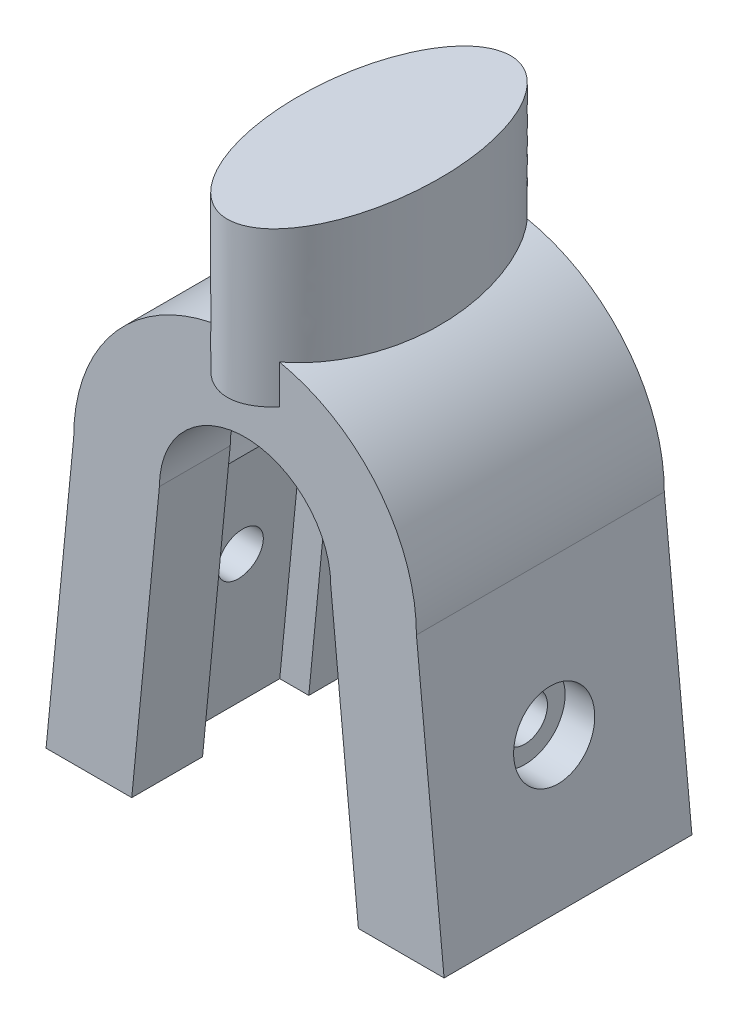
ISO-10303-21;
HEADER;
FILE_DESCRIPTION(('STEP AP214'),'2;1');
FILE_NAME('part.step','',(''),(''),'','','');
FILE_SCHEMA(('AUTOMOTIVE_DESIGN { 1 0 10303 214 1 1 1 1 }'));
ENDSEC;
DATA;
#1=APPLICATION_CONTEXT('core data for automotive mechanical design processes');
#2=APPLICATION_PROTOCOL_DEFINITION('international standard','automotive_design',2000,#1);
#3=PRODUCT_CONTEXT('',#1,'mechanical');
#4=PRODUCT('Part','Part','',(#3));
#5=PRODUCT_RELATED_PRODUCT_CATEGORY('part','',(#4));
#6=PRODUCT_DEFINITION_FORMATION('','',#4);
#7=PRODUCT_DEFINITION_CONTEXT('part definition',#1,'design');
#8=PRODUCT_DEFINITION('design','',#6,#7);
#9=PRODUCT_DEFINITION_SHAPE('','',#8);
#10=(LENGTH_UNIT() NAMED_UNIT(*) SI_UNIT(.MILLI.,.METRE.));
#11=(NAMED_UNIT(*) PLANE_ANGLE_UNIT() SI_UNIT($,.RADIAN.));
#12=(NAMED_UNIT(*) SI_UNIT($,.STERADIAN.) SOLID_ANGLE_UNIT());
#13=UNCERTAINTY_MEASURE_WITH_UNIT(LENGTH_MEASURE(1.E-05),#10,'distance_accuracy_value','');
#14=(GEOMETRIC_REPRESENTATION_CONTEXT(3) GLOBAL_UNCERTAINTY_ASSIGNED_CONTEXT((#13)) GLOBAL_UNIT_ASSIGNED_CONTEXT((#10,
#11,#12)) REPRESENTATION_CONTEXT('',''));
#15=CARTESIAN_POINT('',(0.,0.,0.));
#16=DIRECTION('',(0.,0.,1.));
#17=DIRECTION('',(1.,0.,0.));
#18=AXIS2_PLACEMENT_3D('',#15,#16,#17);
#19=CARTESIAN_POINT('',(0.,0.,3.75));
#20=DIRECTION('',(0.,0.,-1.));
#21=DIRECTION('',(-1.,0.,0.));
#22=AXIS2_PLACEMENT_3D('',#19,#20,#21);
#23=CYLINDRICAL_SURFACE('',#22,12.1);
#24=CARTESIAN_POINT('',(2.42061459137964,11.8554048855364,8.75));
#25=CARTESIAN_POINT('',(2.50643618520199,11.8378706884602,8.65498489595022));
#26=CARTESIAN_POINT('',(2.58895416534871,11.8200626652732,8.55712305635404));
#27=CARTESIAN_POINT('',(2.74766163276391,11.7841855013176,8.35683941342592));
#28=CARTESIAN_POINT('',(2.82386656318519,11.7661171328033,8.25442973922325));
#29=CARTESIAN_POINT('',(2.9706080808039,11.7299264411373,8.0457621152009));
#30=CARTESIAN_POINT('',(3.04114825307558,11.7118041597591,7.93950666204494));
#31=CARTESIAN_POINT('',(3.1764969552689,11.6758183855375,7.7245781818871));
#32=CARTESIAN_POINT('',(3.24134668623073,11.6579539812973,7.61593117294931));
#33=CARTESIAN_POINT('',(3.36635063237683,11.6224741966009,7.39584235952127));
#34=CARTESIAN_POINT('',(3.4265017963319,11.6048589839491,7.28439880000834));
#35=CARTESIAN_POINT('',(3.54240598731303,11.5700050782022,7.05914668931327));
#36=CARTESIAN_POINT('',(3.59815735363494,11.5527665290373,6.94533726541942));
#37=CARTESIAN_POINT('',(3.75352692143558,11.5035842013758,6.61308447633006));
#38=CARTESIAN_POINT('',(3.8478144263619,11.472268483465,6.39203973711786));
#39=CARTESIAN_POINT('',(4.02319460997471,11.4119447810334,5.94444545798705));
#40=CARTESIAN_POINT('',(4.10428285461421,11.3829375736797,5.71789409747453));
#41=CARTESIAN_POINT('',(4.25446869365303,11.3276606692834,5.2604978710072));
#42=CARTESIAN_POINT('',(4.32356432479889,11.3013914207398,5.02965230890473));
#43=CARTESIAN_POINT('',(4.45114220240242,11.2517574842043,4.56295447299616));
#44=CARTESIAN_POINT('',(4.50954466593577,11.2284150099442,4.32707814919772));
#45=CARTESIAN_POINT('',(4.61584247495223,11.1851369069308,3.85272857983842));
#46=CARTESIAN_POINT('',(4.66374026592929,11.1652004854857,3.61425595229653));
#47=CARTESIAN_POINT('',(4.74960484193932,11.1289452456146,3.13524295647929));
#48=CARTESIAN_POINT('',(4.78757072140589,11.1126267570831,2.8947024017194));
#49=CARTESIAN_POINT('',(4.85727000828971,11.0823515240966,2.38817607574638));
#50=CARTESIAN_POINT('',(4.88801329341267,11.0687889381914,2.12203038670875));
#51=CARTESIAN_POINT('',(4.93838311971439,11.0464079529169,1.58845935558743));
#52=CARTESIAN_POINT('',(4.95800810248322,11.0375902186241,1.32103383941027));
#53=CARTESIAN_POINT('',(4.98637517162472,11.0248040598191,0.785376662403085));
#54=CARTESIAN_POINT('',(4.99511256832398,11.0208377249919,0.517144704039663));
#55=CARTESIAN_POINT('',(5.00179155164676,11.0178080595537,-0.0195182721785169));
#56=CARTESIAN_POINT('',(4.99973162162342,11.01874541774,-0.287949312702308));
#57=CARTESIAN_POINT('',(4.98478200892606,11.025516592183,-0.824682837932025));
#58=CARTESIAN_POINT('',(4.97188290388153,11.0313546685733,-1.09298500750642));
#59=CARTESIAN_POINT('',(4.93509327257373,11.0478623247859,-1.62864908934115));
#60=CARTESIAN_POINT('',(4.91120436546272,11.0585311928733,-1.89601113426711));
#61=CARTESIAN_POINT('',(4.85216116419241,11.0845646506067,-2.42912171366028));
#62=CARTESIAN_POINT('',(4.81701274635362,11.0999267906486,-2.69487101626076));
#63=CARTESIAN_POINT('',(4.73500716818458,11.1351561989267,-3.22422200603389));
#64=CARTESIAN_POINT('',(4.6881519633556,11.155022714701,-3.48782404429947));
#65=CARTESIAN_POINT('',(4.58767435384198,11.1966905007156,-3.98459666529946));
#66=CARTESIAN_POINT('',(4.53528230427108,11.2180684090467,-4.21805149752168));
#67=CARTESIAN_POINT('',(4.41999711333215,11.263990450246,-4.68205424402655));
#68=CARTESIAN_POINT('',(4.35710392404884,11.2885345975613,-4.9126021450401));
#69=CARTESIAN_POINT('',(4.21997202643504,11.3405124028953,-5.37015393559722));
#70=CARTESIAN_POINT('',(4.1457258181024,11.3679479672835,-5.59715537221579));
#71=CARTESIAN_POINT('',(3.98558673253558,11.4250719431486,-6.04445235444707));
#72=CARTESIAN_POINT('',(3.89980293873047,11.4547382268481,-6.26478950831554));
#73=CARTESIAN_POINT('',(3.71483052378889,11.51605534294,-6.69936989032182));
#74=CARTESIAN_POINT('',(3.61564902062185,11.5477051167847,-6.91361628170725));
#75=CARTESIAN_POINT('',(3.40226016218914,11.6123672197559,-7.33404327167851));
#76=CARTESIAN_POINT('',(3.28807273404452,11.6453777027125,-7.54023410464205));
#77=CARTESIAN_POINT('',(3.11080600130697,11.6934188915174,-7.83015152201138));
#78=CARTESIAN_POINT('',(3.05464653952211,11.708232610106,-7.91817579730383));
#79=CARTESIAN_POINT('',(2.9387097376606,11.737868996183,-8.09178117121448));
#80=CARTESIAN_POINT('',(2.87893343207902,11.7526916599233,-8.17736295822652));
#81=CARTESIAN_POINT('',(2.75523015878577,11.7823078256011,-8.34609924545083));
#82=CARTESIAN_POINT('',(2.69128561079954,11.7971008910601,-8.42924098989957));
#83=CARTESIAN_POINT('',(2.55917578743191,11.8264605479602,-8.59223427803566));
#84=CARTESIAN_POINT('',(2.49100760320486,11.8410269744782,-8.67208348965852));
#85=CARTESIAN_POINT('',(2.42061459137965,11.8554048855364,-8.74999999999999));
#86=B_SPLINE_CURVE_WITH_KNOTS('',3,(#24,#25,#26,#27,#28,#29,#30,#31,#32,#33,#34,#35,#36,#37,#38,
#39,#40,#41,#42,#43,#44,#45,#46,#47,#48,#49,#50,#51,#52,#53,#54,#55,#56,#57,#58,#59,#60,#61,#62,
#63,#64,#65,#66,#67,#68,#69,#70,#71,#72,#73,#74,#75,#76,#77,#78,#79,#80,#81,#82,#83,#84,#85),
.UNSPECIFIED.,.F.,.F.,(4,2,2,2,2,2,2,2,2,2,2,2,2,2,2,2,2,2,2,2,2,2,2,2,2,2,2,2,2,2,4),(0.,
0.387526838223619,0.774075839006698,1.16037824303432,1.54360176442405,1.92707211556356,
2.31068652216508,3.03717761169919,3.7639122510301,4.4907657486345,5.22283910505665,
5.95474185303582,6.68671131080242,7.49119918106149,8.29579978542879,9.1007468404396,
9.90580696539608,10.7115676447232,11.5172096475188,12.3224318701992,13.1275196784085,
13.8479172243028,14.5683180573635,15.2891968724027,16.0036850505045,16.7177951155945,
17.4309662839181,17.7472712881838,18.063486246207,18.381134046899,18.6990030992238),.UNSPECIFIED.);
#87=CARTESIAN_POINT('',(2.42061459137964,11.8554048855364,8.75));
#88=VERTEX_POINT('',#87);
#89=CARTESIAN_POINT('',(2.42061459137964,11.8554048855364,-8.75));
#90=VERTEX_POINT('',#89);
#91=EDGE_CURVE('E254',#88,#90,#86,.T.);
#92=ORIENTED_EDGE('',*,*,#91,.F.);
#93=CARTESIAN_POINT('',(0.,0.,8.75));
#94=DIRECTION('',(0.,0.,1.));
#95=DIRECTION('',(1.,0.,0.));
#96=AXIS2_PLACEMENT_3D('',#93,#94,#95);
#97=CIRCLE('',#96,12.1);
#98=CARTESIAN_POINT('',(12.1,0.,8.75));
#99=VERTEX_POINT('',#98);
#100=EDGE_CURVE('E356',#99,#88,#97,.T.);
#101=ORIENTED_EDGE('',*,*,#100,.F.);
#102=DIRECTION('',(0.,0.,-1.));
#103=VECTOR('',#102,1.);
#104=CARTESIAN_POINT('',(12.1,0.,3.75));
#105=LINE('',#104,#103);
#106=CARTESIAN_POINT('',(12.1,0.,-8.75));
#107=VERTEX_POINT('',#106);
#108=EDGE_CURVE('E184',#99,#107,#105,.T.);
#109=ORIENTED_EDGE('',*,*,#108,.T.);
#110=CARTESIAN_POINT('',(0.,0.,-8.75));
#111=DIRECTION('',(0.,0.,1.));
#112=DIRECTION('',(1.,0.,0.));
#113=AXIS2_PLACEMENT_3D('',#110,#111,#112);
#114=CIRCLE('',#113,12.1);
#115=EDGE_CURVE('E194',#107,#90,#114,.T.);
#116=ORIENTED_EDGE('',*,*,#115,.T.);
#117=EDGE_LOOP('',(#92,#101,#109,#116));
#118=FACE_BOUND('',#117,.T.);
#119=ADVANCED_FACE('F35',(#118),#23,.T.);
#120=CARTESIAN_POINT('',(-2.42061459137964,11.8554048855364,-8.75));
#121=CARTESIAN_POINT('',(-2.50640960584318,11.8378761292543,-8.65501436479337));
#122=CARTESIAN_POINT('',(-2.58890304249934,11.820073705092,-8.55718371453212));
#123=CARTESIAN_POINT('',(-2.7475726145864,11.7842061453629,-8.3569556193633));
#124=CARTESIAN_POINT('',(-2.8237636083726,11.7661417529776,-8.25456984469903));
#125=CARTESIAN_POINT('',(-2.97048289992936,11.7299580814006,-8.04594639518649));
#126=CARTESIAN_POINT('',(-3.04101451798658,11.71183884096,-7.93971103274757));
#127=CARTESIAN_POINT('',(-3.17637817586053,11.6758508337226,-7.72477472042136));
#128=CARTESIAN_POINT('',(-3.24124908708527,11.6579812080104,-7.61609831867762));
#129=CARTESIAN_POINT('',(-3.36629036440665,11.6224917768349,-7.39595315991942));
#130=CARTESIAN_POINT('',(-3.42645786340485,11.6048721290267,-7.28448275357319));
#131=CARTESIAN_POINT('',(-3.54238698902984,11.5700108570483,-7.05918503679259));
#132=CARTESIAN_POINT('',(-3.59814730106425,11.5527693467701,-6.94535703580826));
#133=CARTESIAN_POINT('',(-3.76568792171126,11.4997354021438,-6.58708223154248));
#134=CARTESIAN_POINT('',(-3.87027102378068,11.4647918964883,-6.33911714274294));
#135=CARTESIAN_POINT('',(-4.06307087415462,11.3978870001557,-5.83661056952575));
#136=CARTESIAN_POINT('',(-4.15128774488575,11.3659255871721,-5.5820691343183));
#137=CARTESIAN_POINT('',(-4.31335987439657,11.3054162518381,-5.06682584522103));
#138=CARTESIAN_POINT('',(-4.38714996397016,11.2768840335796,-4.80610174351351));
#139=CARTESIAN_POINT('',(-4.52112309238692,11.223841980531,-4.28073954530075));
#140=CARTESIAN_POINT('',(-4.58130316486027,11.1993330229488,-4.01610060890328));
#141=CARTESIAN_POINT('',(-4.68394470738446,11.1567670821426,-3.50862150217758));
#142=CARTESIAN_POINT('',(-4.72753289042076,11.1383222231204,-3.26604030936564));
#143=CARTESIAN_POINT('',(-4.80474276866003,11.1052323659035,-2.77903066033766));
#144=CARTESIAN_POINT('',(-4.83836329799407,11.0905878122374,-2.53460199145729));
#145=CARTESIAN_POINT('',(-4.92486863646501,11.0525935992835,-1.79910490291822));
#146=CARTESIAN_POINT('',(-4.96337166519415,11.0351943418931,-1.30595431875602));
#147=CARTESIAN_POINT('',(-5.00364363878702,11.0169848168022,-0.317136583432664));
#148=CARTESIAN_POINT('',(-5.00535096286468,11.0162023768752,0.178533398987819));
#149=CARTESIAN_POINT('',(-4.97194898926279,11.0313255026948,1.16829347472161));
#150=CARTESIAN_POINT('',(-4.93685406018197,11.0472245555352,1.66238410913653));
#151=CARTESIAN_POINT('',(-4.85560410183184,11.083045071611,2.39902045427445));
#152=CARTESIAN_POINT('',(-4.82380775507311,11.0969568693415,2.64352702940559));
#153=CARTESIAN_POINT('',(-4.75033860946047,11.1286077215934,3.13080284990089));
#154=CARTESIAN_POINT('',(-4.70866666789344,11.1463464438927,3.37357224418388));
#155=CARTESIAN_POINT('',(-4.61497378855096,11.1854633492711,3.85684368832507));
#156=CARTESIAN_POINT('',(-4.56295163741828,11.2068419590125,4.09734546888492));
#157=CARTESIAN_POINT('',(-4.44832240076297,11.2528316875686,4.57374235281962));
#158=CARTESIAN_POINT('',(-4.38579092864675,11.277419452843,4.80965780341752));
#159=CARTESIAN_POINT('',(-4.24908460111076,11.3296352997176,5.27774514981429));
#160=CARTESIAN_POINT('',(-4.17491053843807,11.3572631742778,5.50991729930948));
#161=CARTESIAN_POINT('',(-4.0138437848437,11.4151829532618,5.96950823198901));
#162=CARTESIAN_POINT('',(-3.92695149716799,11.4454747732101,6.19692716561838));
#163=CARTESIAN_POINT('',(-3.77448651987469,11.4963924268716,6.56095846917733));
#164=CARTESIAN_POINT('',(-3.7132284053103,11.5163563505772,6.69947816452095));
#165=CARTESIAN_POINT('',(-3.58483481359396,11.5569674942369,6.97360096939293));
#166=CARTESIAN_POINT('',(-3.51770199642858,11.5776144023377,7.1092053646376));
#167=CARTESIAN_POINT('',(-3.37710619578076,11.6194030782761,7.37687346977757));
#168=CARTESIAN_POINT('',(-3.30364878386986,11.6405443988454,7.50894016435672));
#169=CARTESIAN_POINT('',(-3.14904239660449,11.6833227155435,7.77016681311085));
#170=CARTESIAN_POINT('',(-3.06782662524979,11.7049625178317,7.89928692763695));
#171=CARTESIAN_POINT('',(-2.89753392158762,11.7482776327216,8.15243865657274));
#172=CARTESIAN_POINT('',(-2.80845051676486,11.7699529598889,8.27646595603618));
#173=CARTESIAN_POINT('',(-2.66824751594478,11.8022354401593,8.45779266896773));
#174=CARTESIAN_POINT('',(-2.62032541156147,11.8129768148837,8.51755163384715));
#175=CARTESIAN_POINT('',(-2.52220404271945,11.8343145904848,8.63521966522098));
#176=CARTESIAN_POINT('',(-2.47200423120985,11.8449109557297,8.69312828155328));
#177=CARTESIAN_POINT('',(-2.42061459137964,11.8554048855364,8.75));
#178=B_SPLINE_CURVE_WITH_KNOTS('',3,(#120,#121,#122,#123,#124,#125,#126,#127,#128,#129,#130,
#131,#132,#133,#134,#135,#136,#137,#138,#139,#140,#141,#142,#143,#144,#145,#146,#147,#148,#149,
#150,#151,#152,#153,#154,#155,#156,#157,#158,#159,#160,#161,#162,#163,#164,#165,#166,#167,#168,
#169,#170,#171,#172,#173,#174,#175,#176,#177),.UNSPECIFIED.,.F.,.F.,(4,2,2,2,2,2,2,2,2,2,2,2,2,
2,2,2,2,2,2,2,2,2,2,2,2,2,2,2,4),(0.,0.387406828586594,0.773872623376962,1.16010999986502,
1.5434429403202,1.92700775904449,2.31068656050792,3.12405145798735,3.9374102708938,
4.75436238075783,5.57149237809692,6.31270680859464,7.05400790123809,8.53700442342335,
10.0224842877363,11.507384396238,12.2480697969671,12.9886909233461,13.7293989241068,
14.4649894483365,15.2005299077227,15.936047051001,16.39423846221,16.8522234734508,
17.3098090777341,17.7717676131552,18.2341097954595,18.4661106318583,18.6981674873665),.UNSPECIFIED.);
#179=CARTESIAN_POINT('',(-2.42061459137964,11.8554048855364,-8.75));
#180=VERTEX_POINT('',#179);
#181=CARTESIAN_POINT('',(-2.42061459137964,11.8554048855364,8.75));
#182=VERTEX_POINT('',#181);
#183=EDGE_CURVE('E50',#180,#182,#178,.T.);
#184=ORIENTED_EDGE('',*,*,#183,.F.);
#185=CARTESIAN_POINT('',(-12.1,0.,-8.75));
#186=VERTEX_POINT('',#185);
#187=EDGE_CURVE('E216',#180,#186,#114,.T.);
#188=ORIENTED_EDGE('',*,*,#187,.T.);
#189=DIRECTION('',(0.,0.,-1.));
#190=VECTOR('',#189,1.);
#191=CARTESIAN_POINT('',(-12.1,0.,3.75));
#192=LINE('',#191,#190);
#193=CARTESIAN_POINT('',(-12.1,0.,8.75));
#194=VERTEX_POINT('',#193);
#195=EDGE_CURVE('E441',#194,#186,#192,.T.);
#196=ORIENTED_EDGE('',*,*,#195,.F.);
#197=EDGE_CURVE('E362',#182,#194,#97,.T.);
#198=ORIENTED_EDGE('',*,*,#197,.F.);
#199=EDGE_LOOP('',(#184,#188,#196,#198));
#200=FACE_BOUND('',#199,.T.);
#201=ADVANCED_FACE('F298',(#200),#23,.T.);
#202=CARTESIAN_POINT('',(0.,0.,8.75));
#203=DIRECTION('',(0.,0.,1.));
#204=DIRECTION('',(1.,0.,0.));
#205=AXIS2_PLACEMENT_3D('',#202,#203,#204);
#206=PLANE('',#205);
#207=ORIENTED_EDGE('',*,*,#100,.T.);
#208=DIRECTION('',(0.,-1.,0.));
#209=VECTOR('',#208,1.);
#210=CARTESIAN_POINT('',(2.42061459137964,14.55,8.75));
#211=LINE('',#210,#209);
#212=CARTESIAN_POINT('',(2.42061459137964,9.1,8.75));
#213=VERTEX_POINT('',#212);
#214=EDGE_CURVE('E360',#88,#213,#211,.T.);
#215=ORIENTED_EDGE('',*,*,#214,.T.);
#216=DIRECTION('',(-1.,0.,0.));
#217=VECTOR('',#216,1.);
#218=CARTESIAN_POINT('',(0.,9.1,8.75));
#219=LINE('',#218,#217);
#220=CARTESIAN_POINT('',(-2.42061459137964,9.1,8.75));
#221=VERTEX_POINT('',#220);
#222=EDGE_CURVE('E450',#213,#221,#219,.T.);
#223=ORIENTED_EDGE('',*,*,#222,.T.);
#224=DIRECTION('',(0.,-1.,0.));
#225=VECTOR('',#224,1.);
#226=CARTESIAN_POINT('',(-2.42061459137964,14.55,8.75));
#227=LINE('',#226,#225);
#228=EDGE_CURVE('E443',#221,#182,#227,.F.);
#229=ORIENTED_EDGE('',*,*,#228,.T.);
#230=ORIENTED_EDGE('',*,*,#197,.T.);
#231=DIRECTION('',(-0.0971236804488314,-0.995272319868323,0.));
#232=VECTOR('',#231,1.);
#233=CARTESIAN_POINT('',(-11.9858605874225,1.16964058012894,8.75));
#234=LINE('',#233,#232);
#235=CARTESIAN_POINT('',(-14.0517006252456,-20.,8.75));
#236=VERTEX_POINT('',#235);
#237=EDGE_CURVE('E361',#194,#236,#234,.T.);
#238=ORIENTED_EDGE('',*,*,#237,.T.);
#239=DIRECTION('',(1.,0.,0.));
#240=VECTOR('',#239,1.);
#241=CARTESIAN_POINT('',(0.,-20.,8.75));
#242=LINE('',#241,#240);
#243=CARTESIAN_POINT('',(-8.00170062524558,-20.,8.75));
#244=VERTEX_POINT('',#243);
#245=EDGE_CURVE('E365',#236,#244,#242,.T.);
#246=ORIENTED_EDGE('',*,*,#245,.T.);
#247=DIRECTION('',(-0.0971236804488313,-0.995272319868323,0.));
#248=VECTOR('',#247,1.);
#249=CARTESIAN_POINT('',(-5.99293029371124,0.584820290064471,8.75));
#250=LINE('',#249,#248);
#251=CARTESIAN_POINT('',(-6.05,0.,8.75));
#252=VERTEX_POINT('',#251);
#253=EDGE_CURVE('E370',#252,#244,#250,.T.);
#254=ORIENTED_EDGE('',*,*,#253,.F.);
#255=CARTESIAN_POINT('',(0.,0.,8.75));
#256=DIRECTION('',(0.,0.,1.));
#257=DIRECTION('',(1.,0.,0.));
#258=AXIS2_PLACEMENT_3D('',#255,#256,#257);
#259=CIRCLE('',#258,6.05);
#260=CARTESIAN_POINT('',(6.05,0.,8.75));
#261=VERTEX_POINT('',#260);
#262=EDGE_CURVE('E373',#252,#261,#259,.F.);
#263=ORIENTED_EDGE('',*,*,#262,.T.);
#264=DIRECTION('',(0.0971236804488314,-0.995272319868323,0.));
#265=VECTOR('',#264,1.);
#266=CARTESIAN_POINT('',(5.99293029371124,0.584820290064471,8.75));
#267=LINE('',#266,#265);
#268=CARTESIAN_POINT('',(8.00170062524558,-20.,8.75));
#269=VERTEX_POINT('',#268);
#270=EDGE_CURVE('E375',#261,#269,#267,.T.);
#271=ORIENTED_EDGE('',*,*,#270,.T.);
#272=DIRECTION('',(1.,0.,0.));
#273=VECTOR('',#272,1.);
#274=CARTESIAN_POINT('',(0.,-20.,8.75));
#275=LINE('',#274,#273);
#276=CARTESIAN_POINT('',(14.0517006252456,-20.,8.75));
#277=VERTEX_POINT('',#276);
#278=EDGE_CURVE('E377',#269,#277,#275,.T.);
#279=ORIENTED_EDGE('',*,*,#278,.T.);
#280=DIRECTION('',(-0.0971236804488313,0.995272319868323,0.));
#281=VECTOR('',#280,1.);
#282=CARTESIAN_POINT('',(11.9858605874225,1.16964058012894,8.75));
#283=LINE('',#282,#281);
#284=EDGE_CURVE('E178',#277,#99,#283,.T.);
#285=ORIENTED_EDGE('',*,*,#284,.T.);
#286=EDGE_LOOP('',(#207,#215,#223,#229,#230,#238,#246,#254,#263,#271,#279,#285));
#287=FACE_BOUND('',#286,.T.);
#288=ADVANCED_FACE('F294',(#287),#206,.T.);
#289=CARTESIAN_POINT('',(17.6120820458774,-10.,0.));
#290=DIRECTION('',(-1.,0.,0.));
#291=DIRECTION('',(0.,0.,1.));
#292=AXIS2_PLACEMENT_3D('',#289,#290,#291);
#293=CYLINDRICAL_SURFACE('',#292,1.6);
#294=CARTESIAN_POINT('',(9.06942991345195,-10.,0.));
#295=DIRECTION('',(0.995210353394793,0.0977565982213493,0.));
#296=DIRECTION('',(-0.0977565982213493,0.995210353394793,0.));
#297=AXIS2_PLACEMENT_3D('',#294,#295,#296);
#298=ELLIPSE('',#297,1.60770031636246,1.6);
#299=CARTESIAN_POINT('',(8.91226659956497,-8.4,0.));
#300=VERTEX_POINT('',#299);
#301=EDGE_CURVE('E406',#300,#300,#298,.F.);
#302=ORIENTED_EDGE('',*,*,#301,.T.);
#303=EDGE_LOOP('',(#302));
#304=FACE_BOUND('',#303,.T.);
#305=CARTESIAN_POINT('',(11.,-10.,0.));
#306=DIRECTION('',(1.,0.,0.));
#307=DIRECTION('',(0.,0.,-1.));
#308=AXIS2_PLACEMENT_3D('',#305,#306,#307);
#309=CIRCLE('',#308,1.6);
#310=CARTESIAN_POINT('',(11.,-10.,-1.6));
#311=VERTEX_POINT('',#310);
#312=EDGE_CURVE('E444',#311,#311,#309,.T.);
#313=ORIENTED_EDGE('',*,*,#312,.T.);
#314=EDGE_LOOP('',(#313));
#315=FACE_BOUND('',#314,.T.);
#316=ADVANCED_FACE('F297',(#304,#315),#293,.F.);
#317=CARTESIAN_POINT('',(-12.1,0.,3.75));
#318=DIRECTION('',(0.995272319868323,-0.0971236804488314,0.));
#319=DIRECTION('',(0.0971236804488314,0.995272319868323,0.));
#320=AXIS2_PLACEMENT_3D('',#317,#318,#319);
#321=PLANE('',#320);
#322=CARTESIAN_POINT('',(-13.0758503126228,-10.,0.));
#323=DIRECTION('',(0.995272319868323,-0.0971236804488314,0.));
#324=DIRECTION('',(0.0971236804488314,0.995272319868323,0.));
#325=AXIS2_PLACEMENT_3D('',#322,#323,#324);
#326=ELLIPSE('',#325,1.60760021961797,1.6);
#327=CARTESIAN_POINT('',(-12.9197142626031,-8.4,0.));
#328=VERTEX_POINT('',#327);
#329=EDGE_CURVE('E403',#328,#328,#326,.F.);
#330=ORIENTED_EDGE('',*,*,#329,.F.);
#331=EDGE_LOOP('',(#330));
#332=FACE_BOUND('',#331,.T.);
#333=ORIENTED_EDGE('',*,*,#195,.T.);
#334=DIRECTION('',(-0.0971236804488314,-0.995272319868323,0.));
#335=VECTOR('',#334,1.);
#336=CARTESIAN_POINT('',(-11.9858605874225,1.16964058012894,-8.75));
#337=LINE('',#336,#335);
#338=CARTESIAN_POINT('',(-14.0517006252456,-20.,-8.75));
#339=VERTEX_POINT('',#338);
#340=EDGE_CURVE('E213',#186,#339,#337,.T.);
#341=ORIENTED_EDGE('',*,*,#340,.T.);
#342=DIRECTION('',(0.,0.,-1.));
#343=VECTOR('',#342,1.);
#344=CARTESIAN_POINT('',(-14.0517006252456,-20.,3.75));
#345=LINE('',#344,#343);
#346=EDGE_CURVE('E439',#236,#339,#345,.T.);
#347=ORIENTED_EDGE('',*,*,#346,.F.);
#348=ORIENTED_EDGE('',*,*,#237,.F.);
#349=EDGE_LOOP('',(#333,#341,#347,#348));
#350=FACE_BOUND('',#349,.T.);
#351=ADVANCED_FACE('F338',(#332,#350),#321,.F.);
#352=CARTESIAN_POINT('',(-14.0517006252456,-20.,3.75));
#353=DIRECTION('',(0.,1.,0.));
#354=DIRECTION('',(-1.,0.,0.));
#355=AXIS2_PLACEMENT_3D('',#352,#353,#354);
#356=PLANE('',#355);
#357=ORIENTED_EDGE('',*,*,#346,.T.);
#358=DIRECTION('',(1.,0.,0.));
#359=VECTOR('',#358,1.);
#360=CARTESIAN_POINT('',(0.,-20.,-8.75));
#361=LINE('',#360,#359);
#362=CARTESIAN_POINT('',(-8.00170062524558,-20.,-8.75));
#363=VERTEX_POINT('',#362);
#364=EDGE_CURVE('E210',#339,#363,#361,.T.);
#365=ORIENTED_EDGE('',*,*,#364,.T.);
#366=DIRECTION('',(0.,0.,1.));
#367=VECTOR('',#366,1.);
#368=CARTESIAN_POINT('',(-8.00170062524558,-20.,-8.75));
#369=LINE('',#368,#367);
#370=CARTESIAN_POINT('',(-8.00170062524558,-20.,-3.75));
#371=VERTEX_POINT('',#370);
#372=EDGE_CURVE('E218',#363,#371,#369,.T.);
#373=ORIENTED_EDGE('',*,*,#372,.T.);
#374=DIRECTION('',(1.,0.,0.));
#375=VECTOR('',#374,1.);
#376=CARTESIAN_POINT('',(0.,-20.,-3.75));
#377=LINE('',#376,#375);
#378=CARTESIAN_POINT('',(-10.0517006252456,-20.,-3.75));
#379=VERTEX_POINT('',#378);
#380=EDGE_CURVE('E195',#379,#371,#377,.T.);
#381=ORIENTED_EDGE('',*,*,#380,.F.);
#382=DIRECTION('',(0.,0.,-1.));
#383=VECTOR('',#382,1.);
#384=CARTESIAN_POINT('',(-10.0517006252456,-20.,3.75));
#385=LINE('',#384,#383);
#386=CARTESIAN_POINT('',(-10.0517006252456,-20.,3.75));
#387=VERTEX_POINT('',#386);
#388=EDGE_CURVE('E436',#387,#379,#385,.T.);
#389=ORIENTED_EDGE('',*,*,#388,.F.);
#390=DIRECTION('',(1.,0.,0.));
#391=VECTOR('',#390,1.);
#392=CARTESIAN_POINT('',(0.,-20.,3.75));
#393=LINE('',#392,#391);
#394=CARTESIAN_POINT('',(-8.00170062524558,-20.,3.75));
#395=VERTEX_POINT('',#394);
#396=EDGE_CURVE('E380',#387,#395,#393,.T.);
#397=ORIENTED_EDGE('',*,*,#396,.T.);
#398=DIRECTION('',(0.,0.,-1.));
#399=VECTOR('',#398,1.);
#400=CARTESIAN_POINT('',(-8.00170062524558,-20.,8.75));
#401=LINE('',#400,#399);
#402=EDGE_CURVE('E400',#244,#395,#401,.T.);
#403=ORIENTED_EDGE('',*,*,#402,.F.);
#404=ORIENTED_EDGE('',*,*,#245,.F.);
#405=EDGE_LOOP('',(#357,#365,#373,#381,#389,#397,#403,#404));
#406=FACE_BOUND('',#405,.T.);
#407=ADVANCED_FACE('F335',(#406),#356,.F.);
#408=CARTESIAN_POINT('',(-10.0517006252456,-20.,3.75));
#409=DIRECTION('',(-0.995210353394793,0.0977565982213493,0.));
#410=DIRECTION('',(-0.0977565982213493,-0.995210353394793,0.));
#411=AXIS2_PLACEMENT_3D('',#408,#409,#410);
#412=PLANE('',#411);
#413=CARTESIAN_POINT('',(-9.06942991345195,-10.,0.));
#414=DIRECTION('',(-0.995210353394793,0.0977565982213493,0.));
#415=DIRECTION('',(-0.0977565982213493,-0.995210353394793,0.));
#416=AXIS2_PLACEMENT_3D('',#413,#414,#415);
#417=ELLIPSE('',#416,1.60770031636246,1.6);
#418=CARTESIAN_POINT('',(-9.22659322733893,-11.6,0.));
#419=VERTEX_POINT('',#418);
#420=EDGE_CURVE('E409',#419,#419,#417,.F.);
#421=ORIENTED_EDGE('',*,*,#420,.F.);
#422=EDGE_LOOP('',(#421));
#423=FACE_BOUND('',#422,.T.);
#424=DIRECTION('',(0.0977565982213493,0.995210353394793,0.));
#425=VECTOR('',#424,1.);
#426=CARTESIAN_POINT('',(-10.0517006252456,-20.,-3.75));
#427=LINE('',#426,#425);
#428=CARTESIAN_POINT('',(-8.425,-3.43938584633943,-3.75));
#429=VERTEX_POINT('',#428);
#430=EDGE_CURVE('E412',#379,#429,#427,.T.);
#431=ORIENTED_EDGE('',*,*,#430,.T.);
#432=DIRECTION('',(0.,0.,-1.));
#433=VECTOR('',#432,1.);
#434=CARTESIAN_POINT('',(-8.425,-3.43938584633943,3.75));
#435=LINE('',#434,#433);
#436=CARTESIAN_POINT('',(-8.425,-3.43938584633943,3.75));
#437=VERTEX_POINT('',#436);
#438=EDGE_CURVE('E433',#437,#429,#435,.T.);
#439=ORIENTED_EDGE('',*,*,#438,.F.);
#440=DIRECTION('',(0.0977565982213493,0.995210353394793,0.));
#441=VECTOR('',#440,1.);
#442=CARTESIAN_POINT('',(-10.0517006252456,-20.,3.75));
#443=LINE('',#442,#441);
#444=EDGE_CURVE('E413',#387,#437,#443,.T.);
#445=ORIENTED_EDGE('',*,*,#444,.F.);
#446=ORIENTED_EDGE('',*,*,#388,.T.);
#447=EDGE_LOOP('',(#431,#439,#445,#446));
#448=FACE_BOUND('',#447,.T.);
#449=ADVANCED_FACE('F331',(#423,#448),#412,.F.);
#450=CARTESIAN_POINT('',(0.,0.,3.75));
#451=DIRECTION('',(0.,0.,-1.));
#452=DIRECTION('',(-1.,0.,0.));
#453=AXIS2_PLACEMENT_3D('',#450,#451,#452);
#454=CYLINDRICAL_SURFACE('',#453,9.1);
#455=CARTESIAN_POINT('',(0.,0.,-3.75));
#456=DIRECTION('',(0.,0.,-1.));
#457=DIRECTION('',(1.,0.,0.));
#458=AXIS2_PLACEMENT_3D('',#455,#456,#457);
#459=CIRCLE('',#458,9.1);
#460=CARTESIAN_POINT('',(8.425,-3.43938584633943,-3.75));
#461=VERTEX_POINT('',#460);
#462=EDGE_CURVE('E424',#429,#461,#459,.T.);
#463=ORIENTED_EDGE('',*,*,#462,.T.);
#464=DIRECTION('',(0.,0.,-1.));
#465=VECTOR('',#464,1.);
#466=CARTESIAN_POINT('',(8.425,-3.43938584633943,3.75));
#467=LINE('',#466,#465);
#468=CARTESIAN_POINT('',(8.425,-3.43938584633943,3.75));
#469=VERTEX_POINT('',#468);
#470=EDGE_CURVE('E430',#469,#461,#467,.T.);
#471=ORIENTED_EDGE('',*,*,#470,.F.);
#472=CARTESIAN_POINT('',(0.,0.,3.75));
#473=DIRECTION('',(0.,0.,-1.));
#474=DIRECTION('',(1.,0.,0.));
#475=AXIS2_PLACEMENT_3D('',#472,#473,#474);
#476=CIRCLE('',#475,9.1);
#477=EDGE_CURVE('E416',#437,#469,#476,.T.);
#478=ORIENTED_EDGE('',*,*,#477,.F.);
#479=ORIENTED_EDGE('',*,*,#438,.T.);
#480=EDGE_LOOP('',(#463,#471,#478,#479));
#481=FACE_BOUND('',#480,.T.);
#482=ADVANCED_FACE('F327',(#481),#454,.F.);
#483=CARTESIAN_POINT('',(8.425,-3.43938584633943,3.75));
#484=DIRECTION('',(0.995210353394793,0.0977565982213493,0.));
#485=DIRECTION('',(-0.0977565982213493,0.995210353394793,0.));
#486=AXIS2_PLACEMENT_3D('',#483,#484,#485);
#487=PLANE('',#486);
#488=ORIENTED_EDGE('',*,*,#301,.F.);
#489=EDGE_LOOP('',(#488));
#490=FACE_BOUND('',#489,.T.);
#491=DIRECTION('',(0.0977565982213493,-0.995210353394793,0.));
#492=VECTOR('',#491,1.);
#493=CARTESIAN_POINT('',(8.425,-3.43938584633943,-3.75));
#494=LINE('',#493,#492);
#495=CARTESIAN_POINT('',(10.0517006252456,-20.,-3.75));
#496=VERTEX_POINT('',#495);
#497=EDGE_CURVE('E417',#461,#496,#494,.T.);
#498=ORIENTED_EDGE('',*,*,#497,.T.);
#499=DIRECTION('',(0.,0.,-1.));
#500=VECTOR('',#499,1.);
#501=CARTESIAN_POINT('',(10.0517006252456,-20.,3.75));
#502=LINE('',#501,#500);
#503=CARTESIAN_POINT('',(10.0517006252456,-20.,3.75));
#504=VERTEX_POINT('',#503);
#505=EDGE_CURVE('E183',#504,#496,#502,.T.);
#506=ORIENTED_EDGE('',*,*,#505,.F.);
#507=DIRECTION('',(0.0977565982213493,-0.995210353394793,0.));
#508=VECTOR('',#507,1.);
#509=CARTESIAN_POINT('',(8.425,-3.43938584633943,3.75));
#510=LINE('',#509,#508);
#511=EDGE_CURVE('E419',#469,#504,#510,.T.);
#512=ORIENTED_EDGE('',*,*,#511,.F.);
#513=ORIENTED_EDGE('',*,*,#470,.T.);
#514=EDGE_LOOP('',(#498,#506,#512,#513));
#515=FACE_BOUND('',#514,.T.);
#516=ADVANCED_FACE('F324',(#490,#515),#487,.F.);
#517=CARTESIAN_POINT('',(10.0517006252456,-20.,3.75));
#518=DIRECTION('',(0.,1.,0.));
#519=DIRECTION('',(-1.,0.,0.));
#520=AXIS2_PLACEMENT_3D('',#517,#518,#519);
#521=PLANE('',#520);
#522=ORIENTED_EDGE('',*,*,#505,.T.);
#523=DIRECTION('',(1.,0.,0.));
#524=VECTOR('',#523,1.);
#525=CARTESIAN_POINT('',(0.,-20.,-3.75));
#526=LINE('',#525,#524);
#527=CARTESIAN_POINT('',(8.00170062524558,-20.,-3.75));
#528=VERTEX_POINT('',#527);
#529=EDGE_CURVE('E219',#528,#496,#526,.T.);
#530=ORIENTED_EDGE('',*,*,#529,.F.);
#531=DIRECTION('',(0.,0.,1.));
#532=VECTOR('',#531,1.);
#533=CARTESIAN_POINT('',(8.00170062524558,-20.,-8.75));
#534=LINE('',#533,#532);
#535=CARTESIAN_POINT('',(8.00170062524558,-20.,-8.75));
#536=VERTEX_POINT('',#535);
#537=EDGE_CURVE('E200',#536,#528,#534,.T.);
#538=ORIENTED_EDGE('',*,*,#537,.F.);
#539=DIRECTION('',(1.,0.,0.));
#540=VECTOR('',#539,1.);
#541=CARTESIAN_POINT('',(0.,-20.,-8.75));
#542=LINE('',#541,#540);
#543=CARTESIAN_POINT('',(14.0517006252456,-20.,-8.75));
#544=VERTEX_POINT('',#543);
#545=EDGE_CURVE('E191',#536,#544,#542,.T.);
#546=ORIENTED_EDGE('',*,*,#545,.T.);
#547=DIRECTION('',(0.,0.,-1.));
#548=VECTOR('',#547,1.);
#549=CARTESIAN_POINT('',(14.0517006252456,-20.,3.75));
#550=LINE('',#549,#548);
#551=EDGE_CURVE('E172',#277,#544,#550,.T.);
#552=ORIENTED_EDGE('',*,*,#551,.F.);
#553=ORIENTED_EDGE('',*,*,#278,.F.);
#554=DIRECTION('',(0.,0.,-1.));
#555=VECTOR('',#554,1.);
#556=CARTESIAN_POINT('',(8.00170062524558,-20.,8.75));
#557=LINE('',#556,#555);
#558=CARTESIAN_POINT('',(8.00170062524558,-20.,3.75));
#559=VERTEX_POINT('',#558);
#560=EDGE_CURVE('E379',#269,#559,#557,.T.);
#561=ORIENTED_EDGE('',*,*,#560,.T.);
#562=DIRECTION('',(1.,0.,0.));
#563=VECTOR('',#562,1.);
#564=CARTESIAN_POINT('',(0.,-20.,3.75));
#565=LINE('',#564,#563);
#566=EDGE_CURVE('E390',#559,#504,#565,.T.);
#567=ORIENTED_EDGE('',*,*,#566,.T.);
#568=EDGE_LOOP('',(#522,#530,#538,#546,#552,#553,#561,#567));
#569=FACE_BOUND('',#568,.T.);
#570=ADVANCED_FACE('F198',(#569),#521,.F.);
#571=CARTESIAN_POINT('',(14.0517006252456,-20.,3.75));
#572=DIRECTION('',(-0.995272319868323,-0.0971236804488313,0.));
#573=DIRECTION('',(0.0971236804488313,-0.995272319868323,0.));
#574=AXIS2_PLACEMENT_3D('',#571,#572,#573);
#575=PLANE('',#574);
#576=CARTESIAN_POINT('',(13.0758503126228,-10.,0.));
#577=DIRECTION('',(-0.995272319868323,-0.0971236804488313,0.));
#578=DIRECTION('',(-0.0971236804488313,0.995272319868323,0.));
#579=AXIS2_PLACEMENT_3D('',#576,#577,#578);
#580=ELLIPSE('',#579,2.86353789119451,2.85);
#581=CARTESIAN_POINT('',(12.7977329735253,-7.15,0.));
#582=VERTEX_POINT('',#581);
#583=EDGE_CURVE('E383',#582,#582,#580,.F.);
#584=ORIENTED_EDGE('',*,*,#583,.F.);
#585=EDGE_LOOP('',(#584));
#586=FACE_BOUND('',#585,.T.);
#587=ORIENTED_EDGE('',*,*,#551,.T.);
#588=DIRECTION('',(-0.0971236804488313,0.995272319868323,0.));
#589=VECTOR('',#588,1.);
#590=CARTESIAN_POINT('',(11.9858605874225,1.16964058012894,-8.75));
#591=LINE('',#590,#589);
#592=EDGE_CURVE('E175',#544,#107,#591,.T.);
#593=ORIENTED_EDGE('',*,*,#592,.T.);
#594=ORIENTED_EDGE('',*,*,#108,.F.);
#595=ORIENTED_EDGE('',*,*,#284,.F.);
#596=EDGE_LOOP('',(#587,#593,#594,#595));
#597=FACE_BOUND('',#596,.T.);
#598=ADVANCED_FACE('F174',(#586,#597),#575,.F.);
#599=ORIENTED_EDGE('',*,*,#329,.T.);
#600=EDGE_LOOP('',(#599));
#601=FACE_BOUND('',#600,.T.);
#602=ORIENTED_EDGE('',*,*,#420,.T.);
#603=EDGE_LOOP('',(#602));
#604=FACE_BOUND('',#603,.T.);
#605=ADVANCED_FACE('F304',(#601,#604),#293,.F.);
#606=CARTESIAN_POINT('',(0.,0.,3.75));
#607=DIRECTION('',(0.,0.,1.));
#608=DIRECTION('',(1.,0.,0.));
#609=AXIS2_PLACEMENT_3D('',#606,#607,#608);
#610=PLANE('',#609);
#611=ORIENTED_EDGE('',*,*,#396,.F.);
#612=ORIENTED_EDGE('',*,*,#444,.T.);
#613=ORIENTED_EDGE('',*,*,#477,.T.);
#614=ORIENTED_EDGE('',*,*,#511,.T.);
#615=ORIENTED_EDGE('',*,*,#566,.F.);
#616=DIRECTION('',(0.0971236804488314,-0.995272319868323,0.));
#617=VECTOR('',#616,1.);
#618=CARTESIAN_POINT('',(5.99293029371124,0.584820290064471,3.75));
#619=LINE('',#618,#617);
#620=CARTESIAN_POINT('',(6.05,0.,3.75));
#621=VERTEX_POINT('',#620);
#622=EDGE_CURVE('E388',#621,#559,#619,.T.);
#623=ORIENTED_EDGE('',*,*,#622,.F.);
#624=CARTESIAN_POINT('',(0.,0.,3.75));
#625=DIRECTION('',(0.,0.,1.));
#626=DIRECTION('',(1.,0.,0.));
#627=AXIS2_PLACEMENT_3D('',#624,#625,#626);
#628=CIRCLE('',#627,6.05);
#629=CARTESIAN_POINT('',(-6.05,0.,3.75));
#630=VERTEX_POINT('',#629);
#631=EDGE_CURVE('E386',#630,#621,#628,.F.);
#632=ORIENTED_EDGE('',*,*,#631,.F.);
#633=DIRECTION('',(-0.0971236804488313,-0.995272319868323,0.));
#634=VECTOR('',#633,1.);
#635=CARTESIAN_POINT('',(-5.99293029371124,0.584820290064471,3.75));
#636=LINE('',#635,#634);
#637=EDGE_CURVE('E382',#630,#395,#636,.T.);
#638=ORIENTED_EDGE('',*,*,#637,.T.);
#639=EDGE_LOOP('',(#611,#612,#613,#614,#615,#623,#632,#638));
#640=FACE_BOUND('',#639,.T.);
#641=ADVANCED_FACE('F300',(#640),#610,.F.);
#642=CARTESIAN_POINT('',(-5.99293029371124,0.584820290064471,8.75));
#643=DIRECTION('',(0.995272319868323,-0.0971236804488313,0.));
#644=DIRECTION('',(0.0971236804488313,0.995272319868323,0.));
#645=AXIS2_PLACEMENT_3D('',#642,#643,#644);
#646=PLANE('',#645);
#647=ORIENTED_EDGE('',*,*,#637,.F.);
#648=DIRECTION('',(0.,0.,-1.));
#649=VECTOR('',#648,1.);
#650=CARTESIAN_POINT('',(-6.05,0.,8.75));
#651=LINE('',#650,#649);
#652=EDGE_CURVE('E398',#252,#630,#651,.T.);
#653=ORIENTED_EDGE('',*,*,#652,.F.);
#654=ORIENTED_EDGE('',*,*,#253,.T.);
#655=ORIENTED_EDGE('',*,*,#402,.T.);
#656=EDGE_LOOP('',(#647,#653,#654,#655));
#657=FACE_BOUND('',#656,.T.);
#658=ADVANCED_FACE('F303',(#657),#646,.T.);
#659=CARTESIAN_POINT('',(0.,0.,8.75));
#660=DIRECTION('',(0.,0.,-1.));
#661=DIRECTION('',(-1.,0.,0.));
#662=AXIS2_PLACEMENT_3D('',#659,#660,#661);
#663=CYLINDRICAL_SURFACE('',#662,6.05);
#664=ORIENTED_EDGE('',*,*,#631,.T.);
#665=DIRECTION('',(0.,0.,-1.));
#666=VECTOR('',#665,1.);
#667=CARTESIAN_POINT('',(6.05,0.,8.75));
#668=LINE('',#667,#666);
#669=EDGE_CURVE('E395',#261,#621,#668,.T.);
#670=ORIENTED_EDGE('',*,*,#669,.F.);
#671=ORIENTED_EDGE('',*,*,#262,.F.);
#672=ORIENTED_EDGE('',*,*,#652,.T.);
#673=EDGE_LOOP('',(#664,#670,#671,#672));
#674=FACE_BOUND('',#673,.T.);
#675=ADVANCED_FACE('F308',(#674),#663,.F.);
#676=CARTESIAN_POINT('',(5.99293029371124,0.584820290064471,8.75));
#677=DIRECTION('',(0.995272319868323,0.0971236804488314,0.));
#678=DIRECTION('',(-0.0971236804488314,0.995272319868323,0.));
#679=AXIS2_PLACEMENT_3D('',#676,#677,#678);
#680=PLANE('',#679);
#681=ORIENTED_EDGE('',*,*,#622,.T.);
#682=ORIENTED_EDGE('',*,*,#560,.F.);
#683=ORIENTED_EDGE('',*,*,#270,.F.);
#684=ORIENTED_EDGE('',*,*,#669,.T.);
#685=EDGE_LOOP('',(#681,#682,#683,#684));
#686=FACE_BOUND('',#685,.T.);
#687=ADVANCED_FACE('F292',(#686),#680,.F.);
#688=CARTESIAN_POINT('',(14.,-10.,0.));
#689=DIRECTION('',(-1.,0.,0.));
#690=DIRECTION('',(0.,0.,1.));
#691=AXIS2_PLACEMENT_3D('',#688,#689,#690);
#692=CYLINDRICAL_SURFACE('',#691,2.85);
#693=CARTESIAN_POINT('',(11.,-10.,0.));
#694=DIRECTION('',(1.,0.,0.));
#695=DIRECTION('',(0.,0.,-1.));
#696=AXIS2_PLACEMENT_3D('',#693,#694,#695);
#697=CIRCLE('',#696,2.85);
#698=CARTESIAN_POINT('',(11.,-10.,-2.85));
#699=VERTEX_POINT('',#698);
#700=EDGE_CURVE('E357',#699,#699,#697,.T.);
#701=ORIENTED_EDGE('',*,*,#700,.F.);
#702=EDGE_LOOP('',(#701));
#703=FACE_BOUND('',#702,.T.);
#704=ORIENTED_EDGE('',*,*,#583,.T.);
#705=EDGE_LOOP('',(#704));
#706=FACE_BOUND('',#705,.T.);
#707=ADVANCED_FACE('F288',(#703,#706),#692,.F.);
#708=CARTESIAN_POINT('',(11.,-10.,0.));
#709=DIRECTION('',(1.,0.,0.));
#710=DIRECTION('',(0.,0.,-1.));
#711=AXIS2_PLACEMENT_3D('',#708,#709,#710);
#712=PLANE('',#711);
#713=ORIENTED_EDGE('',*,*,#312,.F.);
#714=EDGE_LOOP('',(#713));
#715=FACE_BOUND('',#714,.T.);
#716=ORIENTED_EDGE('',*,*,#700,.T.);
#717=EDGE_LOOP('',(#716));
#718=FACE_BOUND('',#717,.T.);
#719=ADVANCED_FACE('F285',(#715,#718),#712,.T.);
#720=CARTESIAN_POINT('',(0.,9.1,0.));
#721=DIRECTION('',(0.,1.,0.));
#722=DIRECTION('',(0.,0.,1.));
#723=AXIS2_PLACEMENT_3D('',#720,#721,#722);
#724=PLANE('',#723);
#725=CARTESIAN_POINT('',(0.,9.1,0.));
#726=DIRECTION('',(0.,1.,0.));
#727=DIRECTION('',(0.,0.,1.));
#728=AXIS2_PLACEMENT_3D('',#725,#726,#727);
#729=ELLIPSE('',#728,10.,5.);
#730=CARTESIAN_POINT('',(2.42061459137964,9.1,-8.75));
#731=VERTEX_POINT('',#730);
#732=CARTESIAN_POINT('',(-2.42061459137964,9.1,-8.75));
#733=VERTEX_POINT('',#732);
#734=EDGE_CURVE('E247',#731,#733,#729,.T.);
#735=ORIENTED_EDGE('',*,*,#734,.F.);
#736=DIRECTION('',(-1.,0.,0.));
#737=VECTOR('',#736,1.);
#738=CARTESIAN_POINT('',(0.,9.1,-8.75));
#739=LINE('',#738,#737);
#740=EDGE_CURVE('E238',#731,#733,#739,.T.);
#741=ORIENTED_EDGE('',*,*,#740,.T.);
#742=EDGE_LOOP('',(#735,#741));
#743=FACE_BOUND('',#742,.T.);
#744=ADVANCED_FACE('F268',(#743),#724,.F.);
#745=CARTESIAN_POINT('',(0.,20.,10.));
#746=CARTESIAN_POINT('',(0.,9.1,10.));
#747=CARTESIAN_POINT('',(10.,20.,10.));
#748=CARTESIAN_POINT('',(10.,9.1,10.));
#749=CARTESIAN_POINT('',(10.,20.,-10.));
#750=CARTESIAN_POINT('',(10.,9.1,-10.));
#751=CARTESIAN_POINT('',(0.,20.,-10.));
#752=CARTESIAN_POINT('',(0.,9.1,-10.));
#753=CARTESIAN_POINT('',(-10.,20.,-10.));
#754=CARTESIAN_POINT('',(-10.,9.1,-10.));
#755=CARTESIAN_POINT('',(-10.,20.,10.));
#756=CARTESIAN_POINT('',(-10.,9.1,10.));
#757=CARTESIAN_POINT('',(0.,20.,10.));
#758=CARTESIAN_POINT('',(0.,9.1,10.));
#759=(BOUNDED_SURFACE() B_SPLINE_SURFACE(3,1,((#745,#746),(#747,#748),(#749,#750),(#751,#752),
(#753,#754),(#755,#756),(#757,#758)),.UNSPECIFIED.,.T.,.F.,.F.) B_SPLINE_SURFACE_WITH_KNOTS((4,
3,4),(2,2),(0.,0.5,1.),(0.,1.),
.UNSPECIFIED.) GEOMETRIC_REPRESENTATION_ITEM() RATIONAL_B_SPLINE_SURFACE(((1.,1.),
(0.333333333333333,0.333333333333333),(0.333333333333333,0.333333333333333),(1.,1.),
(0.333333333333333,0.333333333333333),(0.333333333333333,0.333333333333333),(1.,1.))) REPRESENTATION_ITEM('') SURFACE());
#760=CARTESIAN_POINT('',(0.,20.,0.));
#761=DIRECTION('',(0.,1.,0.));
#762=DIRECTION('',(0.,0.,1.));
#763=AXIS2_PLACEMENT_3D('',#760,#761,#762);
#764=ELLIPSE('',#763,10.,5.);
#765=CARTESIAN_POINT('',(0.,20.,10.));
#766=VERTEX_POINT('',#765);
#767=EDGE_CURVE('E241',#766,#766,#764,.T.);
#768=DIRECTION('',(0.,-1.,0.));
#769=VECTOR('',#768,1.);
#770=CARTESIAN_POINT('',(2.42061459137964,14.55,-8.75));
#771=LINE('',#770,#769);
#772=EDGE_CURVE('E11',#90,#731,#771,.T.);
#773=DIRECTION('',(0.,-1.,0.));
#774=VECTOR('',#773,1.);
#775=CARTESIAN_POINT('',(-2.42061459137964,14.55,-8.75));
#776=LINE('',#775,#774);
#777=EDGE_CURVE('E43',#733,#180,#776,.F.);
#778=EDGE_CURVE('E244',#221,#213,#729,.T.);
#779=ORIENTED_EDGE('',*,*,#767,.F.);
#780=EDGE_LOOP('',(#779));
#781=FACE_BOUND('',#780,.T.);
#782=ORIENTED_EDGE('',*,*,#91,.T.);
#783=ORIENTED_EDGE('',*,*,#772,.T.);
#784=ORIENTED_EDGE('',*,*,#734,.T.);
#785=ORIENTED_EDGE('',*,*,#777,.T.);
#786=ORIENTED_EDGE('',*,*,#183,.T.);
#787=ORIENTED_EDGE('',*,*,#228,.F.);
#788=ORIENTED_EDGE('',*,*,#778,.T.);
#789=ORIENTED_EDGE('',*,*,#214,.F.);
#790=EDGE_LOOP('',(#782,#783,#784,#785,#786,#787,#788,#789));
#791=FACE_BOUND('',#790,.T.);
#792=ADVANCED_FACE('F260',(#781,#791),#759,.F.);
#793=CARTESIAN_POINT('',(0.,20.,0.));
#794=DIRECTION('',(0.,1.,0.));
#795=DIRECTION('',(0.,0.,1.));
#796=AXIS2_PLACEMENT_3D('',#793,#794,#795);
#797=PLANE('',#796);
#798=ORIENTED_EDGE('',*,*,#767,.T.);
#799=EDGE_LOOP('',(#798));
#800=FACE_BOUND('',#799,.T.);
#801=ADVANCED_FACE('F267',(#800),#797,.T.);
#802=ORIENTED_EDGE('',*,*,#222,.F.);
#803=ORIENTED_EDGE('',*,*,#778,.F.);
#804=EDGE_LOOP('',(#802,#803));
#805=FACE_BOUND('',#804,.T.);
#806=ADVANCED_FACE('F270',(#805),#724,.F.);
#807=CARTESIAN_POINT('',(0.,0.,-8.75));
#808=DIRECTION('',(0.,0.,-1.));
#809=DIRECTION('',(1.,0.,0.));
#810=AXIS2_PLACEMENT_3D('',#807,#808,#809);
#811=PLANE('',#810);
#812=ORIENTED_EDGE('',*,*,#772,.F.);
#813=ORIENTED_EDGE('',*,*,#115,.F.);
#814=ORIENTED_EDGE('',*,*,#592,.F.);
#815=ORIENTED_EDGE('',*,*,#545,.F.);
#816=DIRECTION('',(0.0971236804488314,-0.995272319868323,0.));
#817=VECTOR('',#816,1.);
#818=CARTESIAN_POINT('',(5.99293029371124,0.584820290064471,-8.75));
#819=LINE('',#818,#817);
#820=CARTESIAN_POINT('',(6.05,0.,-8.75));
#821=VERTEX_POINT('',#820);
#822=EDGE_CURVE('E201',#821,#536,#819,.T.);
#823=ORIENTED_EDGE('',*,*,#822,.F.);
#824=CARTESIAN_POINT('',(0.,0.,-8.75));
#825=DIRECTION('',(0.,0.,1.));
#826=DIRECTION('',(1.,0.,0.));
#827=AXIS2_PLACEMENT_3D('',#824,#825,#826);
#828=CIRCLE('',#827,6.05);
#829=CARTESIAN_POINT('',(-6.05,0.,-8.75));
#830=VERTEX_POINT('',#829);
#831=EDGE_CURVE('E203',#830,#821,#828,.F.);
#832=ORIENTED_EDGE('',*,*,#831,.F.);
#833=DIRECTION('',(-0.0971236804488313,-0.995272319868323,0.));
#834=VECTOR('',#833,1.);
#835=CARTESIAN_POINT('',(-5.99293029371124,0.584820290064471,-8.75));
#836=LINE('',#835,#834);
#837=EDGE_CURVE('E208',#830,#363,#836,.T.);
#838=ORIENTED_EDGE('',*,*,#837,.T.);
#839=ORIENTED_EDGE('',*,*,#364,.F.);
#840=ORIENTED_EDGE('',*,*,#340,.F.);
#841=ORIENTED_EDGE('',*,*,#187,.F.);
#842=ORIENTED_EDGE('',*,*,#777,.F.);
#843=ORIENTED_EDGE('',*,*,#740,.F.);
#844=EDGE_LOOP('',(#812,#813,#814,#815,#823,#832,#838,#839,#840,#841,#842,#843));
#845=FACE_BOUND('',#844,.T.);
#846=ADVANCED_FACE('F189',(#845),#811,.T.);
#847=CARTESIAN_POINT('',(0.,0.,-3.75));
#848=DIRECTION('',(0.,0.,-1.));
#849=DIRECTION('',(1.,0.,0.));
#850=AXIS2_PLACEMENT_3D('',#847,#848,#849);
#851=PLANE('',#850);
#852=ORIENTED_EDGE('',*,*,#462,.F.);
#853=ORIENTED_EDGE('',*,*,#430,.F.);
#854=ORIENTED_EDGE('',*,*,#380,.T.);
#855=DIRECTION('',(-0.0971236804488313,-0.995272319868323,0.));
#856=VECTOR('',#855,1.);
#857=CARTESIAN_POINT('',(-5.99293029371124,0.584820290064471,-3.75));
#858=LINE('',#857,#856);
#859=CARTESIAN_POINT('',(-6.05,0.,-3.75));
#860=VERTEX_POINT('',#859);
#861=EDGE_CURVE('E227',#860,#371,#858,.T.);
#862=ORIENTED_EDGE('',*,*,#861,.F.);
#863=CARTESIAN_POINT('',(0.,0.,-3.75));
#864=DIRECTION('',(0.,0.,1.));
#865=DIRECTION('',(1.,0.,0.));
#866=AXIS2_PLACEMENT_3D('',#863,#864,#865);
#867=CIRCLE('',#866,6.05);
#868=CARTESIAN_POINT('',(6.05,0.,-3.75));
#869=VERTEX_POINT('',#868);
#870=EDGE_CURVE('E224',#860,#869,#867,.F.);
#871=ORIENTED_EDGE('',*,*,#870,.T.);
#872=DIRECTION('',(0.0971236804488314,-0.995272319868323,0.));
#873=VECTOR('',#872,1.);
#874=CARTESIAN_POINT('',(5.99293029371124,0.584820290064471,-3.75));
#875=LINE('',#874,#873);
#876=EDGE_CURVE('E221',#869,#528,#875,.T.);
#877=ORIENTED_EDGE('',*,*,#876,.T.);
#878=ORIENTED_EDGE('',*,*,#529,.T.);
#879=ORIENTED_EDGE('',*,*,#497,.F.);
#880=EDGE_LOOP('',(#852,#853,#854,#862,#871,#877,#878,#879));
#881=FACE_BOUND('',#880,.T.);
#882=ADVANCED_FACE('F481',(#881),#851,.F.);
#883=CARTESIAN_POINT('',(5.99293029371124,0.584820290064471,-8.75));
#884=DIRECTION('',(-0.995272319868323,-0.0971236804488314,0.));
#885=DIRECTION('',(0.0971236804488314,-0.995272319868323,0.));
#886=AXIS2_PLACEMENT_3D('',#883,#884,#885);
#887=PLANE('',#886);
#888=ORIENTED_EDGE('',*,*,#876,.F.);
#889=DIRECTION('',(0.,0.,1.));
#890=VECTOR('',#889,1.);
#891=CARTESIAN_POINT('',(6.05,0.,-8.75));
#892=LINE('',#891,#890);
#893=EDGE_CURVE('E235',#821,#869,#892,.T.);
#894=ORIENTED_EDGE('',*,*,#893,.F.);
#895=ORIENTED_EDGE('',*,*,#822,.T.);
#896=ORIENTED_EDGE('',*,*,#537,.T.);
#897=EDGE_LOOP('',(#888,#894,#895,#896));
#898=FACE_BOUND('',#897,.T.);
#899=ADVANCED_FACE('F271',(#898),#887,.T.);
#900=CARTESIAN_POINT('',(0.,0.,-8.75));
#901=DIRECTION('',(0.,0.,1.));
#902=DIRECTION('',(1.,0.,0.));
#903=AXIS2_PLACEMENT_3D('',#900,#901,#902);
#904=CYLINDRICAL_SURFACE('',#903,6.05);
#905=ORIENTED_EDGE('',*,*,#870,.F.);
#906=DIRECTION('',(0.,0.,1.));
#907=VECTOR('',#906,1.);
#908=CARTESIAN_POINT('',(-6.05,0.,-8.75));
#909=LINE('',#908,#907);
#910=EDGE_CURVE('E233',#830,#860,#909,.T.);
#911=ORIENTED_EDGE('',*,*,#910,.F.);
#912=ORIENTED_EDGE('',*,*,#831,.T.);
#913=ORIENTED_EDGE('',*,*,#893,.T.);
#914=EDGE_LOOP('',(#905,#911,#912,#913));
#915=FACE_BOUND('',#914,.T.);
#916=ADVANCED_FACE('F495',(#915),#904,.F.);
#917=CARTESIAN_POINT('',(-5.99293029371124,0.584820290064471,-8.75));
#918=DIRECTION('',(-0.995272319868323,0.0971236804488313,0.));
#919=DIRECTION('',(-0.0971236804488313,-0.995272319868323,0.));
#920=AXIS2_PLACEMENT_3D('',#917,#918,#919);
#921=PLANE('',#920);
#922=ORIENTED_EDGE('',*,*,#861,.T.);
#923=ORIENTED_EDGE('',*,*,#372,.F.);
#924=ORIENTED_EDGE('',*,*,#837,.F.);
#925=ORIENTED_EDGE('',*,*,#910,.T.);
#926=EDGE_LOOP('',(#922,#923,#924,#925));
#927=FACE_BOUND('',#926,.T.);
#928=ADVANCED_FACE('F502',(#927),#921,.F.);
#929=CLOSED_SHELL('',(#119,#201,#288,#316,#351,#407,#449,#482,#516,#570,#598,#605,#641,#658,
#675,#687,#707,#719,#744,#792,#801,#806,#846,#882,#899,#916,#928));
#930=MANIFOLD_SOLID_BREP('B2',#929);
#931=ADVANCED_BREP_SHAPE_REPRESENTATION('',(#18,#930),#14);
#932=SHAPE_DEFINITION_REPRESENTATION(#9,#931);
ENDSEC;
END-ISO-10303-21;
